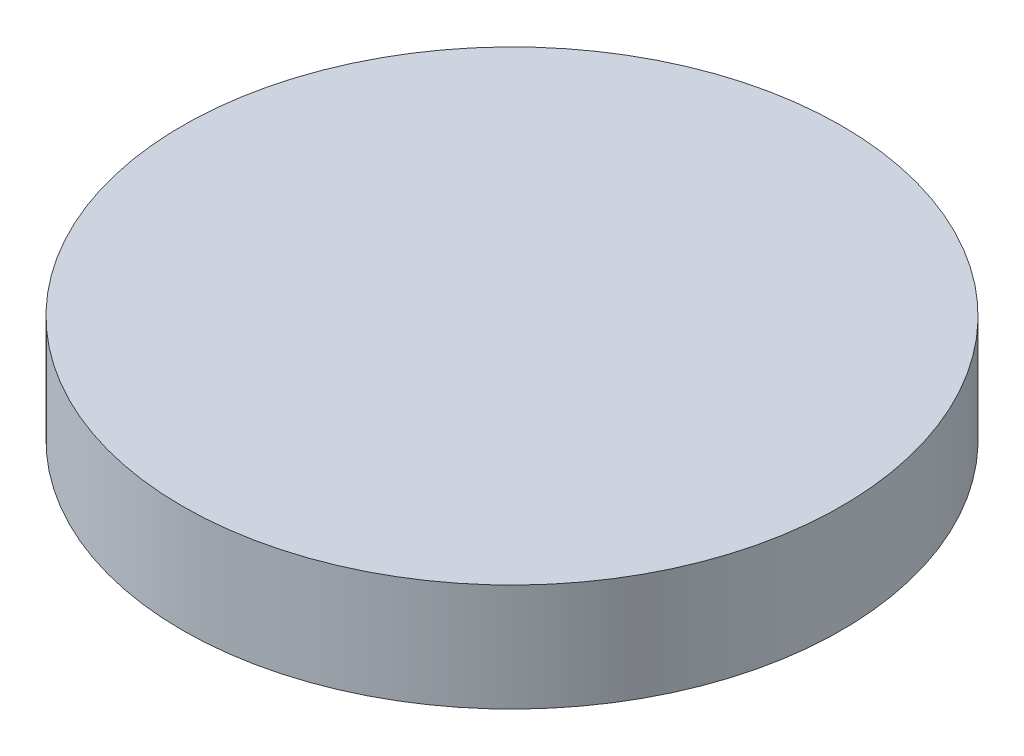
ISO-10303-21;
HEADER;
FILE_DESCRIPTION(('STEP AP214'),'2;1');
FILE_NAME('part.step','',(''),(''),'','','');
FILE_SCHEMA(('AUTOMOTIVE_DESIGN { 1 0 10303 214 1 1 1 1 }'));
ENDSEC;
DATA;
#1=APPLICATION_CONTEXT('core data for automotive mechanical design processes');
#2=APPLICATION_PROTOCOL_DEFINITION('international standard','automotive_design',2000,#1);
#3=PRODUCT_CONTEXT('',#1,'mechanical');
#4=PRODUCT('Part','Part','',(#3));
#5=PRODUCT_RELATED_PRODUCT_CATEGORY('part','',(#4));
#6=PRODUCT_DEFINITION_FORMATION('','',#4);
#7=PRODUCT_DEFINITION_CONTEXT('part definition',#1,'design');
#8=PRODUCT_DEFINITION('design','',#6,#7);
#9=PRODUCT_DEFINITION_SHAPE('','',#8);
#10=(LENGTH_UNIT() NAMED_UNIT(*) SI_UNIT(.MILLI.,.METRE.));
#11=(NAMED_UNIT(*) PLANE_ANGLE_UNIT() SI_UNIT($,.RADIAN.));
#12=(NAMED_UNIT(*) SI_UNIT($,.STERADIAN.) SOLID_ANGLE_UNIT());
#13=UNCERTAINTY_MEASURE_WITH_UNIT(LENGTH_MEASURE(1.E-05),#10,'distance_accuracy_value','');
#14=(GEOMETRIC_REPRESENTATION_CONTEXT(3) GLOBAL_UNCERTAINTY_ASSIGNED_CONTEXT((#13)) GLOBAL_UNIT_ASSIGNED_CONTEXT((#10,
#11,#12)) REPRESENTATION_CONTEXT('',''));
#15=CARTESIAN_POINT('',(0.,0.,0.));
#16=DIRECTION('',(0.,0.,1.));
#17=DIRECTION('',(1.,0.,0.));
#18=AXIS2_PLACEMENT_3D('',#15,#16,#17);
#19=CARTESIAN_POINT('',(0.,22.,0.));
#20=DIRECTION('',(0.,-1.,0.));
#21=DIRECTION('',(0.,0.,-1.));
#22=AXIS2_PLACEMENT_3D('',#19,#20,#21);
#23=CYLINDRICAL_SURFACE('',#22,67.5);
#24=CARTESIAN_POINT('',(0.,22.,0.));
#25=DIRECTION('',(0.,1.,0.));
#26=DIRECTION('',(0.,0.,1.));
#27=AXIS2_PLACEMENT_3D('',#24,#25,#26);
#28=CIRCLE('',#27,67.5);
#29=CARTESIAN_POINT('',(0.,22.,67.5));
#30=VERTEX_POINT('',#29);
#31=EDGE_CURVE('E10',#30,#30,#28,.T.);
#32=ORIENTED_EDGE('',*,*,#31,.F.);
#33=EDGE_LOOP('',(#32));
#34=FACE_BOUND('',#33,.T.);
#35=CARTESIAN_POINT('',(0.,0.,0.));
#36=DIRECTION('',(0.,1.,0.));
#37=DIRECTION('',(0.,0.,1.));
#38=AXIS2_PLACEMENT_3D('',#35,#36,#37);
#39=CIRCLE('',#38,67.5);
#40=CARTESIAN_POINT('',(0.,0.,67.5));
#41=VERTEX_POINT('',#40);
#42=EDGE_CURVE('E40',#41,#41,#39,.T.);
#43=ORIENTED_EDGE('',*,*,#42,.T.);
#44=EDGE_LOOP('',(#43));
#45=FACE_BOUND('',#44,.T.);
#46=ADVANCED_FACE('F37',(#34,#45),#23,.T.);
#47=CARTESIAN_POINT('',(0.,22.,0.));
#48=DIRECTION('',(0.,1.,0.));
#49=DIRECTION('',(0.,0.,1.));
#50=AXIS2_PLACEMENT_3D('',#47,#48,#49);
#51=PLANE('',#50);
#52=ORIENTED_EDGE('',*,*,#31,.T.);
#53=EDGE_LOOP('',(#52));
#54=FACE_BOUND('',#53,.T.);
#55=ADVANCED_FACE('F54',(#54),#51,.T.);
#56=CARTESIAN_POINT('',(0.,0.,0.));
#57=DIRECTION('',(0.,1.,0.));
#58=DIRECTION('',(0.,0.,1.));
#59=AXIS2_PLACEMENT_3D('',#56,#57,#58);
#60=PLANE('',#59);
#61=ORIENTED_EDGE('',*,*,#42,.F.);
#62=EDGE_LOOP('',(#61));
#63=FACE_BOUND('',#62,.T.);
#64=ADVANCED_FACE('F52',(#63),#60,.F.);
#65=CLOSED_SHELL('',(#46,#55,#64));
#66=MANIFOLD_SOLID_BREP('B2',#65);
#67=ADVANCED_BREP_SHAPE_REPRESENTATION('',(#18,#66),#14);
#68=SHAPE_DEFINITION_REPRESENTATION(#9,#67);
ENDSEC;
END-ISO-10303-21;
